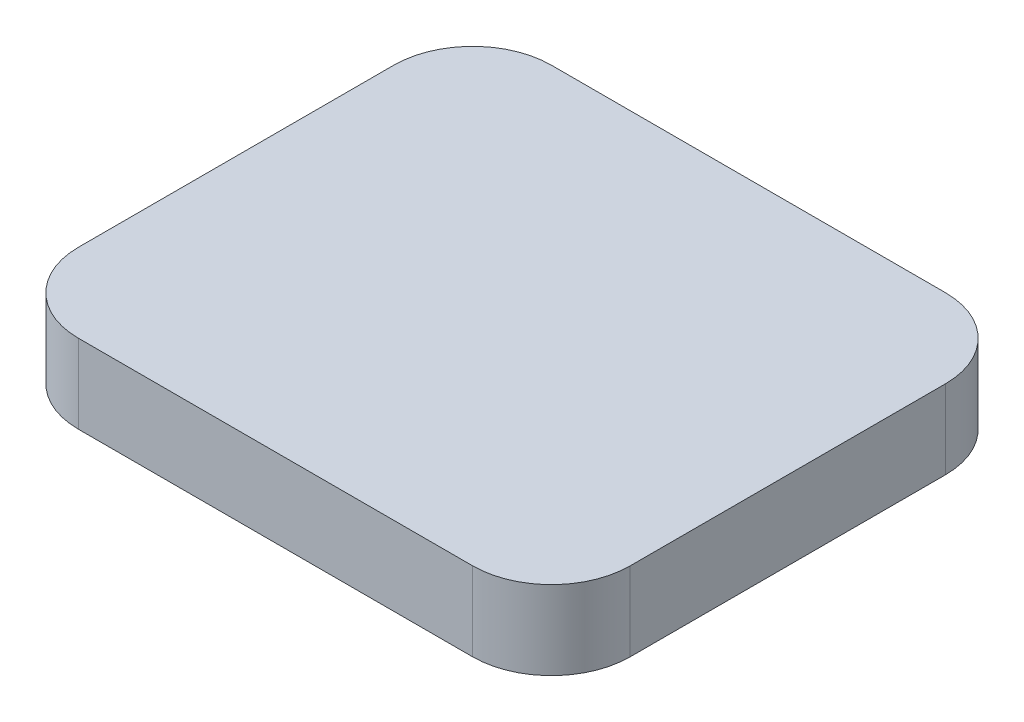
ISO-10303-21;
HEADER;
FILE_DESCRIPTION(('STEP AP214'),'2;1');
FILE_NAME('part.step','',(''),(''),'','','');
FILE_SCHEMA(('AUTOMOTIVE_DESIGN { 1 0 10303 214 1 1 1 1 }'));
ENDSEC;
DATA;
#1=APPLICATION_CONTEXT('core data for automotive mechanical design processes');
#2=APPLICATION_PROTOCOL_DEFINITION('international standard','automotive_design',2000,#1);
#3=PRODUCT_CONTEXT('',#1,'mechanical');
#4=PRODUCT('Part','Part','',(#3));
#5=PRODUCT_RELATED_PRODUCT_CATEGORY('part','',(#4));
#6=PRODUCT_DEFINITION_FORMATION('','',#4);
#7=PRODUCT_DEFINITION_CONTEXT('part definition',#1,'design');
#8=PRODUCT_DEFINITION('design','',#6,#7);
#9=PRODUCT_DEFINITION_SHAPE('','',#8);
#10=(LENGTH_UNIT() NAMED_UNIT(*) SI_UNIT(.MILLI.,.METRE.));
#11=(NAMED_UNIT(*) PLANE_ANGLE_UNIT() SI_UNIT($,.RADIAN.));
#12=(NAMED_UNIT(*) SI_UNIT($,.STERADIAN.) SOLID_ANGLE_UNIT());
#13=UNCERTAINTY_MEASURE_WITH_UNIT(LENGTH_MEASURE(1.E-05),#10,'distance_accuracy_value','');
#14=(GEOMETRIC_REPRESENTATION_CONTEXT(3) GLOBAL_UNCERTAINTY_ASSIGNED_CONTEXT((#13)) GLOBAL_UNIT_ASSIGNED_CONTEXT((#10,
#11,#12)) REPRESENTATION_CONTEXT('',''));
#15=CARTESIAN_POINT('',(0.,0.,0.));
#16=DIRECTION('',(0.,0.,1.));
#17=DIRECTION('',(1.,0.,0.));
#18=AXIS2_PLACEMENT_3D('',#15,#16,#17);
#19=CARTESIAN_POINT('',(2.5,1.,-2.));
#20=DIRECTION('',(0.,-1.,0.));
#21=DIRECTION('',(0.,0.,-1.));
#22=AXIS2_PLACEMENT_3D('',#19,#20,#21);
#23=CYLINDRICAL_SURFACE('',#22,1.);
#24=CARTESIAN_POINT('',(2.5,0.,-2.));
#25=DIRECTION('',(0.,1.,0.));
#26=DIRECTION('',(0.,0.,1.));
#27=AXIS2_PLACEMENT_3D('',#24,#25,#26);
#28=CIRCLE('',#27,1.);
#29=CARTESIAN_POINT('',(3.5,0.,-1.99999999999999));
#30=VERTEX_POINT('',#29);
#31=CARTESIAN_POINT('',(2.49999999999999,0.,-3.));
#32=VERTEX_POINT('',#31);
#33=EDGE_CURVE('E129',#30,#32,#28,.T.);
#34=ORIENTED_EDGE('',*,*,#33,.T.);
#35=DIRECTION('',(0.,-1.,0.));
#36=VECTOR('',#35,1.);
#37=CARTESIAN_POINT('',(2.49999999999999,1.,-3.));
#38=LINE('',#37,#36);
#39=CARTESIAN_POINT('',(2.49999999999999,1.,-3.));
#40=VERTEX_POINT('',#39);
#41=EDGE_CURVE('E11',#40,#32,#38,.T.);
#42=ORIENTED_EDGE('',*,*,#41,.F.);
#43=CARTESIAN_POINT('',(2.5,1.,-2.));
#44=DIRECTION('',(0.,1.,0.));
#45=DIRECTION('',(0.,0.,1.));
#46=AXIS2_PLACEMENT_3D('',#43,#44,#45);
#47=CIRCLE('',#46,1.);
#48=CARTESIAN_POINT('',(3.5,1.,-1.99999999999999));
#49=VERTEX_POINT('',#48);
#50=EDGE_CURVE('E143',#49,#40,#47,.T.);
#51=ORIENTED_EDGE('',*,*,#50,.F.);
#52=DIRECTION('',(0.,-1.,0.));
#53=VECTOR('',#52,1.);
#54=CARTESIAN_POINT('',(3.5,1.,-1.99999999999999));
#55=LINE('',#54,#53);
#56=EDGE_CURVE('E125',#49,#30,#55,.T.);
#57=ORIENTED_EDGE('',*,*,#56,.T.);
#58=EDGE_LOOP('',(#34,#42,#51,#57));
#59=FACE_BOUND('',#58,.T.);
#60=ADVANCED_FACE('F33',(#59),#23,.T.);
#61=CARTESIAN_POINT('',(-2.49999999999999,1.,-3.));
#62=DIRECTION('',(0.,0.,1.));
#63=DIRECTION('',(1.,0.,0.));
#64=AXIS2_PLACEMENT_3D('',#61,#62,#63);
#65=PLANE('',#64);
#66=DIRECTION('',(-1.,0.,0.));
#67=VECTOR('',#66,1.);
#68=CARTESIAN_POINT('',(-2.49999999999999,0.,-3.));
#69=LINE('',#68,#67);
#70=CARTESIAN_POINT('',(-2.49999999999999,0.,-3.));
#71=VERTEX_POINT('',#70);
#72=EDGE_CURVE('E132',#32,#71,#69,.T.);
#73=ORIENTED_EDGE('',*,*,#72,.T.);
#74=DIRECTION('',(0.,-1.,0.));
#75=VECTOR('',#74,1.);
#76=CARTESIAN_POINT('',(-2.49999999999999,1.,-3.));
#77=LINE('',#76,#75);
#78=CARTESIAN_POINT('',(-2.49999999999999,1.,-3.));
#79=VERTEX_POINT('',#78);
#80=EDGE_CURVE('E41',#79,#71,#77,.T.);
#81=ORIENTED_EDGE('',*,*,#80,.F.);
#82=DIRECTION('',(-1.,0.,0.));
#83=VECTOR('',#82,1.);
#84=CARTESIAN_POINT('',(-2.49999999999999,1.,-3.));
#85=LINE('',#84,#83);
#86=EDGE_CURVE('E92',#40,#79,#85,.T.);
#87=ORIENTED_EDGE('',*,*,#86,.F.);
#88=ORIENTED_EDGE('',*,*,#41,.T.);
#89=EDGE_LOOP('',(#73,#81,#87,#88));
#90=FACE_BOUND('',#89,.T.);
#91=ADVANCED_FACE('F178',(#90),#65,.F.);
#92=CARTESIAN_POINT('',(-2.5,1.,-2.));
#93=DIRECTION('',(0.,-1.,0.));
#94=DIRECTION('',(0.,0.,-1.));
#95=AXIS2_PLACEMENT_3D('',#92,#93,#94);
#96=CYLINDRICAL_SURFACE('',#95,1.);
#97=CARTESIAN_POINT('',(-2.5,0.,-2.));
#98=DIRECTION('',(0.,1.,0.));
#99=DIRECTION('',(0.,0.,1.));
#100=AXIS2_PLACEMENT_3D('',#97,#98,#99);
#101=CIRCLE('',#100,1.);
#102=CARTESIAN_POINT('',(-3.5,0.,-1.99999999999999));
#103=VERTEX_POINT('',#102);
#104=EDGE_CURVE('E134',#71,#103,#101,.T.);
#105=ORIENTED_EDGE('',*,*,#104,.T.);
#106=DIRECTION('',(0.,-1.,0.));
#107=VECTOR('',#106,1.);
#108=CARTESIAN_POINT('',(-3.5,1.,-1.99999999999999));
#109=LINE('',#108,#107);
#110=CARTESIAN_POINT('',(-3.5,1.,-1.99999999999999));
#111=VERTEX_POINT('',#110);
#112=EDGE_CURVE('E150',#111,#103,#109,.T.);
#113=ORIENTED_EDGE('',*,*,#112,.F.);
#114=CARTESIAN_POINT('',(-2.5,1.,-2.));
#115=DIRECTION('',(0.,1.,0.));
#116=DIRECTION('',(0.,0.,1.));
#117=AXIS2_PLACEMENT_3D('',#114,#115,#116);
#118=CIRCLE('',#117,1.);
#119=EDGE_CURVE('E158',#79,#111,#118,.T.);
#120=ORIENTED_EDGE('',*,*,#119,.F.);
#121=ORIENTED_EDGE('',*,*,#80,.T.);
#122=EDGE_LOOP('',(#105,#113,#120,#121));
#123=FACE_BOUND('',#122,.T.);
#124=ADVANCED_FACE('F156',(#123),#96,.T.);
#125=CARTESIAN_POINT('',(-3.5,1.,1.99999999999999));
#126=DIRECTION('',(1.,0.,0.));
#127=DIRECTION('',(0.,0.,-1.));
#128=AXIS2_PLACEMENT_3D('',#125,#126,#127);
#129=PLANE('',#128);
#130=DIRECTION('',(0.,0.,1.));
#131=VECTOR('',#130,1.);
#132=CARTESIAN_POINT('',(-3.5,0.,1.99999999999999));
#133=LINE('',#132,#131);
#134=CARTESIAN_POINT('',(-3.5,0.,1.99999999999999));
#135=VERTEX_POINT('',#134);
#136=EDGE_CURVE('E136',#103,#135,#133,.T.);
#137=ORIENTED_EDGE('',*,*,#136,.T.);
#138=DIRECTION('',(0.,-1.,0.));
#139=VECTOR('',#138,1.);
#140=CARTESIAN_POINT('',(-3.5,1.,1.99999999999999));
#141=LINE('',#140,#139);
#142=CARTESIAN_POINT('',(-3.5,1.,1.99999999999999));
#143=VERTEX_POINT('',#142);
#144=EDGE_CURVE('E147',#143,#135,#141,.T.);
#145=ORIENTED_EDGE('',*,*,#144,.F.);
#146=DIRECTION('',(0.,0.,1.));
#147=VECTOR('',#146,1.);
#148=CARTESIAN_POINT('',(-3.5,1.,1.99999999999999));
#149=LINE('',#148,#147);
#150=EDGE_CURVE('E170',#111,#143,#149,.T.);
#151=ORIENTED_EDGE('',*,*,#150,.F.);
#152=ORIENTED_EDGE('',*,*,#112,.T.);
#153=EDGE_LOOP('',(#137,#145,#151,#152));
#154=FACE_BOUND('',#153,.T.);
#155=ADVANCED_FACE('F166',(#154),#129,.F.);
#156=CARTESIAN_POINT('',(-2.5,1.,2.));
#157=DIRECTION('',(0.,-1.,0.));
#158=DIRECTION('',(0.,0.,-1.));
#159=AXIS2_PLACEMENT_3D('',#156,#157,#158);
#160=CYLINDRICAL_SURFACE('',#159,1.);
#161=CARTESIAN_POINT('',(-2.5,0.,2.));
#162=DIRECTION('',(0.,1.,0.));
#163=DIRECTION('',(0.,0.,-1.));
#164=AXIS2_PLACEMENT_3D('',#161,#162,#163);
#165=CIRCLE('',#164,1.);
#166=CARTESIAN_POINT('',(-2.49999999999999,0.,3.));
#167=VERTEX_POINT('',#166);
#168=EDGE_CURVE('E138',#135,#167,#165,.T.);
#169=ORIENTED_EDGE('',*,*,#168,.T.);
#170=DIRECTION('',(0.,-1.,0.));
#171=VECTOR('',#170,1.);
#172=CARTESIAN_POINT('',(-2.49999999999999,1.,3.));
#173=LINE('',#172,#171);
#174=CARTESIAN_POINT('',(-2.49999999999999,1.,3.));
#175=VERTEX_POINT('',#174);
#176=EDGE_CURVE('E120',#175,#167,#173,.T.);
#177=ORIENTED_EDGE('',*,*,#176,.F.);
#178=CARTESIAN_POINT('',(-2.5,1.,2.));
#179=DIRECTION('',(0.,1.,0.));
#180=DIRECTION('',(0.,0.,-1.));
#181=AXIS2_PLACEMENT_3D('',#178,#179,#180);
#182=CIRCLE('',#181,1.);
#183=EDGE_CURVE('E111',#143,#175,#182,.T.);
#184=ORIENTED_EDGE('',*,*,#183,.F.);
#185=ORIENTED_EDGE('',*,*,#144,.T.);
#186=EDGE_LOOP('',(#169,#177,#184,#185));
#187=FACE_BOUND('',#186,.T.);
#188=ADVANCED_FACE('F169',(#187),#160,.T.);
#189=CARTESIAN_POINT('',(-2.49999999999999,1.,3.));
#190=DIRECTION('',(0.,0.,-1.));
#191=DIRECTION('',(-1.,0.,0.));
#192=AXIS2_PLACEMENT_3D('',#189,#190,#191);
#193=PLANE('',#192);
#194=DIRECTION('',(1.,0.,0.));
#195=VECTOR('',#194,1.);
#196=CARTESIAN_POINT('',(-2.49999999999999,0.,3.));
#197=LINE('',#196,#195);
#198=CARTESIAN_POINT('',(2.49999999999999,0.,3.));
#199=VERTEX_POINT('',#198);
#200=EDGE_CURVE('E119',#167,#199,#197,.T.);
#201=ORIENTED_EDGE('',*,*,#200,.T.);
#202=DIRECTION('',(0.,-1.,0.));
#203=VECTOR('',#202,1.);
#204=CARTESIAN_POINT('',(2.49999999999999,1.,3.));
#205=LINE('',#204,#203);
#206=CARTESIAN_POINT('',(2.49999999999999,1.,3.));
#207=VERTEX_POINT('',#206);
#208=EDGE_CURVE('E116',#207,#199,#205,.T.);
#209=ORIENTED_EDGE('',*,*,#208,.F.);
#210=DIRECTION('',(1.,0.,0.));
#211=VECTOR('',#210,1.);
#212=CARTESIAN_POINT('',(-2.49999999999999,1.,3.));
#213=LINE('',#212,#211);
#214=EDGE_CURVE('E105',#175,#207,#213,.T.);
#215=ORIENTED_EDGE('',*,*,#214,.F.);
#216=ORIENTED_EDGE('',*,*,#176,.T.);
#217=EDGE_LOOP('',(#201,#209,#215,#216));
#218=FACE_BOUND('',#217,.T.);
#219=ADVANCED_FACE('F117',(#218),#193,.F.);
#220=CARTESIAN_POINT('',(2.5,1.,2.));
#221=DIRECTION('',(0.,-1.,0.));
#222=DIRECTION('',(0.,0.,-1.));
#223=AXIS2_PLACEMENT_3D('',#220,#221,#222);
#224=CYLINDRICAL_SURFACE('',#223,1.);
#225=CARTESIAN_POINT('',(2.5,0.,2.));
#226=DIRECTION('',(0.,1.,0.));
#227=DIRECTION('',(0.,0.,-1.));
#228=AXIS2_PLACEMENT_3D('',#225,#226,#227);
#229=CIRCLE('',#228,1.);
#230=CARTESIAN_POINT('',(3.5,0.,1.99999999999999));
#231=VERTEX_POINT('',#230);
#232=EDGE_CURVE('E78',#199,#231,#229,.T.);
#233=ORIENTED_EDGE('',*,*,#232,.T.);
#234=DIRECTION('',(0.,-1.,0.));
#235=VECTOR('',#234,1.);
#236=CARTESIAN_POINT('',(3.5,1.,1.99999999999999));
#237=LINE('',#236,#235);
#238=CARTESIAN_POINT('',(3.5,1.,1.99999999999999));
#239=VERTEX_POINT('',#238);
#240=EDGE_CURVE('E121',#239,#231,#237,.T.);
#241=ORIENTED_EDGE('',*,*,#240,.F.);
#242=CARTESIAN_POINT('',(2.5,1.,2.));
#243=DIRECTION('',(0.,1.,0.));
#244=DIRECTION('',(0.,0.,-1.));
#245=AXIS2_PLACEMENT_3D('',#242,#243,#244);
#246=CIRCLE('',#245,1.);
#247=EDGE_CURVE('E109',#207,#239,#246,.T.);
#248=ORIENTED_EDGE('',*,*,#247,.F.);
#249=ORIENTED_EDGE('',*,*,#208,.T.);
#250=EDGE_LOOP('',(#233,#241,#248,#249));
#251=FACE_BOUND('',#250,.T.);
#252=ADVANCED_FACE('F123',(#251),#224,.T.);
#253=CARTESIAN_POINT('',(3.5,1.,1.99999999999999));
#254=DIRECTION('',(-1.,0.,0.));
#255=DIRECTION('',(0.,0.,1.));
#256=AXIS2_PLACEMENT_3D('',#253,#254,#255);
#257=PLANE('',#256);
#258=DIRECTION('',(0.,0.,-1.));
#259=VECTOR('',#258,1.);
#260=CARTESIAN_POINT('',(3.5,0.,1.99999999999999));
#261=LINE('',#260,#259);
#262=EDGE_CURVE('E84',#231,#30,#261,.T.);
#263=ORIENTED_EDGE('',*,*,#262,.T.);
#264=ORIENTED_EDGE('',*,*,#56,.F.);
#265=DIRECTION('',(0.,0.,-1.));
#266=VECTOR('',#265,1.);
#267=CARTESIAN_POINT('',(3.5,1.,1.99999999999999));
#268=LINE('',#267,#266);
#269=EDGE_CURVE('E49',#239,#49,#268,.T.);
#270=ORIENTED_EDGE('',*,*,#269,.F.);
#271=ORIENTED_EDGE('',*,*,#240,.T.);
#272=EDGE_LOOP('',(#263,#264,#270,#271));
#273=FACE_BOUND('',#272,.T.);
#274=ADVANCED_FACE('F194',(#273),#257,.F.);
#275=CARTESIAN_POINT('',(2.5,1.,-2.));
#276=DIRECTION('',(0.,1.,0.));
#277=DIRECTION('',(0.,0.,1.));
#278=AXIS2_PLACEMENT_3D('',#275,#276,#277);
#279=PLANE('',#278);
#280=ORIENTED_EDGE('',*,*,#50,.T.);
#281=ORIENTED_EDGE('',*,*,#86,.T.);
#282=ORIENTED_EDGE('',*,*,#119,.T.);
#283=ORIENTED_EDGE('',*,*,#150,.T.);
#284=ORIENTED_EDGE('',*,*,#183,.T.);
#285=ORIENTED_EDGE('',*,*,#214,.T.);
#286=ORIENTED_EDGE('',*,*,#247,.T.);
#287=ORIENTED_EDGE('',*,*,#269,.T.);
#288=EDGE_LOOP('',(#280,#281,#282,#283,#284,#285,#286,#287));
#289=FACE_BOUND('',#288,.T.);
#290=ADVANCED_FACE('F107',(#289),#279,.T.);
#291=CARTESIAN_POINT('',(2.5,0.,-2.));
#292=DIRECTION('',(0.,1.,0.));
#293=DIRECTION('',(0.,0.,1.));
#294=AXIS2_PLACEMENT_3D('',#291,#292,#293);
#295=PLANE('',#294);
#296=ORIENTED_EDGE('',*,*,#33,.F.);
#297=ORIENTED_EDGE('',*,*,#262,.F.);
#298=ORIENTED_EDGE('',*,*,#232,.F.);
#299=ORIENTED_EDGE('',*,*,#200,.F.);
#300=ORIENTED_EDGE('',*,*,#168,.F.);
#301=ORIENTED_EDGE('',*,*,#136,.F.);
#302=ORIENTED_EDGE('',*,*,#104,.F.);
#303=ORIENTED_EDGE('',*,*,#72,.F.);
#304=EDGE_LOOP('',(#296,#297,#298,#299,#300,#301,#302,#303));
#305=FACE_BOUND('',#304,.T.);
#306=ADVANCED_FACE('F162',(#305),#295,.F.);
#307=CLOSED_SHELL('',(#60,#91,#124,#155,#188,#219,#252,#274,#290,#306));
#308=MANIFOLD_SOLID_BREP('B2',#307);
#309=ADVANCED_BREP_SHAPE_REPRESENTATION('',(#18,#308),#14);
#310=SHAPE_DEFINITION_REPRESENTATION(#9,#309);
ENDSEC;
END-ISO-10303-21;
